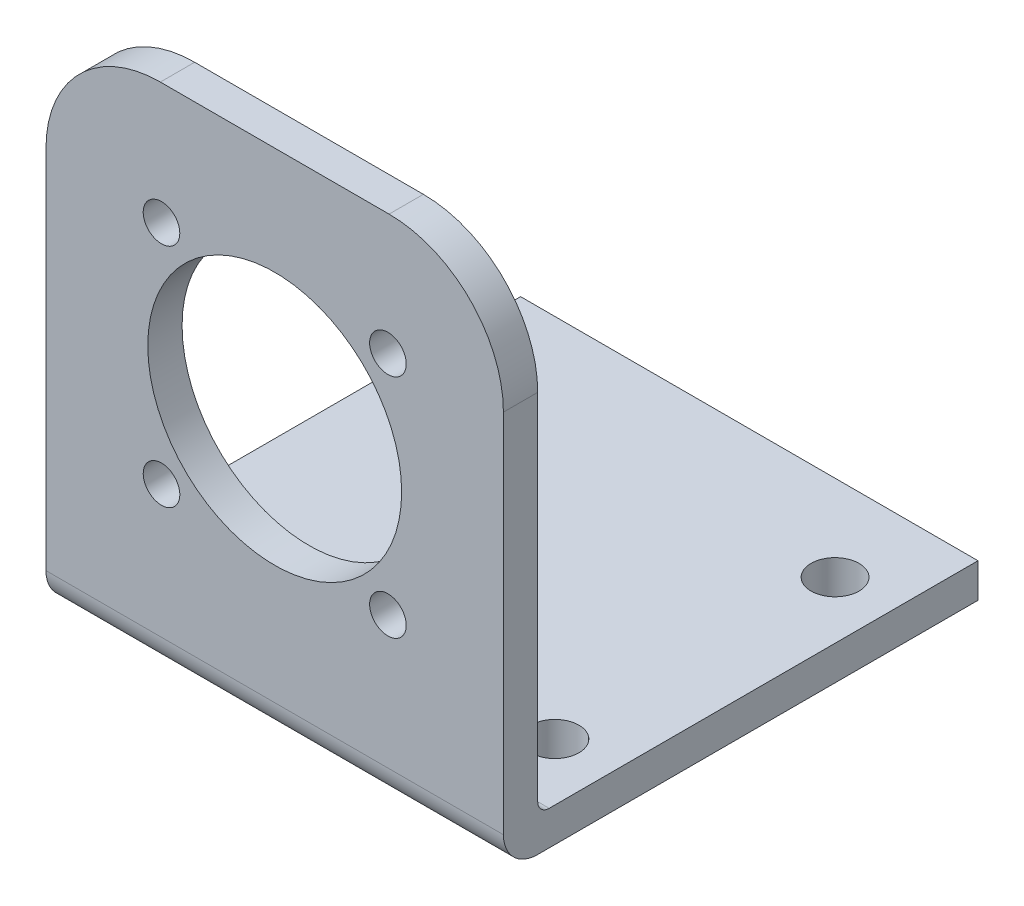
ISO-10303-21;
HEADER;
FILE_DESCRIPTION(('STEP AP214'),'2;1');
FILE_NAME('part.step','',(''),(''),'','','');
FILE_SCHEMA(('AUTOMOTIVE_DESIGN { 1 0 10303 214 1 1 1 1 }'));
ENDSEC;
DATA;
#1=APPLICATION_CONTEXT('core data for automotive mechanical design processes');
#2=APPLICATION_PROTOCOL_DEFINITION('international standard','automotive_design',2000,#1);
#3=PRODUCT_CONTEXT('',#1,'mechanical');
#4=PRODUCT('Part','Part','',(#3));
#5=PRODUCT_RELATED_PRODUCT_CATEGORY('part','',(#4));
#6=PRODUCT_DEFINITION_FORMATION('','',#4);
#7=PRODUCT_DEFINITION_CONTEXT('part definition',#1,'design');
#8=PRODUCT_DEFINITION('design','',#6,#7);
#9=PRODUCT_DEFINITION_SHAPE('','',#8);
#10=(LENGTH_UNIT() NAMED_UNIT(*) SI_UNIT(.MILLI.,.METRE.));
#11=(NAMED_UNIT(*) PLANE_ANGLE_UNIT() SI_UNIT($,.RADIAN.));
#12=(NAMED_UNIT(*) SI_UNIT($,.STERADIAN.) SOLID_ANGLE_UNIT());
#13=UNCERTAINTY_MEASURE_WITH_UNIT(LENGTH_MEASURE(1.E-05),#10,'distance_accuracy_value','');
#14=(GEOMETRIC_REPRESENTATION_CONTEXT(3) GLOBAL_UNCERTAINTY_ASSIGNED_CONTEXT((#13)) GLOBAL_UNIT_ASSIGNED_CONTEXT((#10,
#11,#12)) REPRESENTATION_CONTEXT('',''));
#15=CARTESIAN_POINT('',(0.,0.,0.));
#16=DIRECTION('',(0.,0.,1.));
#17=DIRECTION('',(1.,0.,0.));
#18=AXIS2_PLACEMENT_3D('',#15,#16,#17);
#19=CARTESIAN_POINT('',(0.,0.,3.));
#20=DIRECTION('',(0.,0.,1.));
#21=DIRECTION('',(1.,0.,0.));
#22=AXIS2_PLACEMENT_3D('',#19,#20,#21);
#23=PLANE('',#22);
#24=DIRECTION('',(0.,-1.,0.));
#25=VECTOR('',#24,1.);
#26=CARTESIAN_POINT('',(-20.,20.5,3.));
#27=LINE('',#26,#25);
#28=CARTESIAN_POINT('',(-20.,10.5,3.));
#29=VERTEX_POINT('',#28);
#30=CARTESIAN_POINT('',(-20.,-21.5,3.));
#31=VERTEX_POINT('',#30);
#32=EDGE_CURVE('E202',#29,#31,#27,.T.);
#33=ORIENTED_EDGE('',*,*,#32,.T.);
#34=DIRECTION('',(1.,0.,0.));
#35=VECTOR('',#34,1.);
#36=CARTESIAN_POINT('',(20.,-21.5,3.));
#37=LINE('',#36,#35);
#38=CARTESIAN_POINT('',(20.,-21.5,3.));
#39=VERTEX_POINT('',#38);
#40=EDGE_CURVE('E251',#31,#39,#37,.T.);
#41=ORIENTED_EDGE('',*,*,#40,.T.);
#42=DIRECTION('',(0.,1.,0.));
#43=VECTOR('',#42,1.);
#44=CARTESIAN_POINT('',(20.,20.5,3.));
#45=LINE('',#44,#43);
#46=CARTESIAN_POINT('',(20.,10.5,3.));
#47=VERTEX_POINT('',#46);
#48=EDGE_CURVE('E206',#39,#47,#45,.T.);
#49=ORIENTED_EDGE('',*,*,#48,.T.);
#50=CARTESIAN_POINT('',(10.,10.5,3.));
#51=DIRECTION('',(0.,0.,1.));
#52=DIRECTION('',(1.,0.,0.));
#53=AXIS2_PLACEMENT_3D('',#50,#51,#52);
#54=CIRCLE('',#53,10.);
#55=CARTESIAN_POINT('',(9.99999999999999,20.5,3.));
#56=VERTEX_POINT('',#55);
#57=EDGE_CURVE('E241',#47,#56,#54,.T.);
#58=ORIENTED_EDGE('',*,*,#57,.T.);
#59=DIRECTION('',(-1.,0.,0.));
#60=VECTOR('',#59,1.);
#61=CARTESIAN_POINT('',(-20.,20.5,3.));
#62=LINE('',#61,#60);
#63=CARTESIAN_POINT('',(-10.,20.5,3.));
#64=VERTEX_POINT('',#63);
#65=EDGE_CURVE('E210',#56,#64,#62,.T.);
#66=ORIENTED_EDGE('',*,*,#65,.T.);
#67=CARTESIAN_POINT('',(-9.99999999999999,10.5,3.));
#68=DIRECTION('',(0.,0.,1.));
#69=DIRECTION('',(1.,0.,0.));
#70=AXIS2_PLACEMENT_3D('',#67,#68,#69);
#71=CIRCLE('',#70,10.);
#72=EDGE_CURVE('E244',#64,#29,#71,.T.);
#73=ORIENTED_EDGE('',*,*,#72,.T.);
#74=EDGE_LOOP('',(#33,#41,#49,#58,#66,#73));
#75=FACE_BOUND('',#74,.T.);
#76=CARTESIAN_POINT('',(-9.89949493661161,-9.89949493661172,3.));
#77=DIRECTION('',(0.,0.,1.));
#78=DIRECTION('',(-1.,0.,0.));
#79=AXIS2_PLACEMENT_3D('',#76,#77,#78);
#80=CIRCLE('',#79,1.6);
#81=CARTESIAN_POINT('',(-11.4994949366116,-9.89949493661172,3.));
#82=VERTEX_POINT('',#81);
#83=EDGE_CURVE('E170',#82,#82,#80,.T.);
#84=ORIENTED_EDGE('',*,*,#83,.F.);
#85=EDGE_LOOP('',(#84));
#86=FACE_BOUND('',#85,.T.);
#87=CARTESIAN_POINT('',(9.89949493661161,9.89949493661172,3.));
#88=DIRECTION('',(0.,0.,1.));
#89=DIRECTION('',(-1.,0.,0.));
#90=AXIS2_PLACEMENT_3D('',#87,#88,#89);
#91=CIRCLE('',#90,1.6);
#92=CARTESIAN_POINT('',(8.29949493661161,9.89949493661172,3.));
#93=VERTEX_POINT('',#92);
#94=EDGE_CURVE('E186',#93,#93,#91,.T.);
#95=ORIENTED_EDGE('',*,*,#94,.F.);
#96=EDGE_LOOP('',(#95));
#97=FACE_BOUND('',#96,.T.);
#98=CARTESIAN_POINT('',(0.,0.,3.));
#99=DIRECTION('',(0.,0.,1.));
#100=DIRECTION('',(1.,0.,0.));
#101=AXIS2_PLACEMENT_3D('',#98,#99,#100);
#102=CIRCLE('',#101,11.1);
#103=CARTESIAN_POINT('',(11.1,0.,3.));
#104=VERTEX_POINT('',#103);
#105=EDGE_CURVE('E194',#104,#104,#102,.T.);
#106=ORIENTED_EDGE('',*,*,#105,.F.);
#107=EDGE_LOOP('',(#106));
#108=FACE_BOUND('',#107,.T.);
#109=CARTESIAN_POINT('',(-9.89949493661161,9.89949493661171,3.));
#110=DIRECTION('',(0.,0.,1.));
#111=DIRECTION('',(1.,0.,0.));
#112=AXIS2_PLACEMENT_3D('',#109,#110,#111);
#113=CIRCLE('',#112,1.6);
#114=CARTESIAN_POINT('',(-8.29949493661161,9.89949493661171,3.));
#115=VERTEX_POINT('',#114);
#116=EDGE_CURVE('E178',#115,#115,#113,.T.);
#117=ORIENTED_EDGE('',*,*,#116,.F.);
#118=EDGE_LOOP('',(#117));
#119=FACE_BOUND('',#118,.T.);
#120=CARTESIAN_POINT('',(9.89949493661162,-9.89949493661171,3.));
#121=DIRECTION('',(0.,0.,1.));
#122=DIRECTION('',(1.,0.,0.));
#123=AXIS2_PLACEMENT_3D('',#120,#121,#122);
#124=CIRCLE('',#123,1.6);
#125=CARTESIAN_POINT('',(11.4994949366116,-9.89949493661171,3.));
#126=VERTEX_POINT('',#125);
#127=EDGE_CURVE('E162',#126,#126,#124,.T.);
#128=ORIENTED_EDGE('',*,*,#127,.F.);
#129=EDGE_LOOP('',(#128));
#130=FACE_BOUND('',#129,.T.);
#131=ADVANCED_FACE('F40',(#75,#86,#97,#108,#119,#130),#23,.T.);
#132=CARTESIAN_POINT('',(0.,0.,0.));
#133=DIRECTION('',(0.,0.,1.));
#134=DIRECTION('',(1.,0.,0.));
#135=AXIS2_PLACEMENT_3D('',#132,#133,#134);
#136=PLANE('',#135);
#137=DIRECTION('',(0.,1.,0.));
#138=VECTOR('',#137,1.);
#139=CARTESIAN_POINT('',(20.,20.5,0.));
#140=LINE('',#139,#138);
#141=CARTESIAN_POINT('',(20.,-20.5,0.));
#142=VERTEX_POINT('',#141);
#143=CARTESIAN_POINT('',(20.,10.5,0.));
#144=VERTEX_POINT('',#143);
#145=EDGE_CURVE('E216',#142,#144,#140,.T.);
#146=ORIENTED_EDGE('',*,*,#145,.F.);
#147=DIRECTION('',(-1.,0.,0.));
#148=VECTOR('',#147,1.);
#149=CARTESIAN_POINT('',(0.,-20.5,0.));
#150=LINE('',#149,#148);
#151=CARTESIAN_POINT('',(-20.,-20.5,0.));
#152=VERTEX_POINT('',#151);
#153=EDGE_CURVE('E263',#142,#152,#150,.T.);
#154=ORIENTED_EDGE('',*,*,#153,.T.);
#155=DIRECTION('',(0.,-1.,0.));
#156=VECTOR('',#155,1.);
#157=CARTESIAN_POINT('',(-20.,20.5,0.));
#158=LINE('',#157,#156);
#159=CARTESIAN_POINT('',(-20.,10.5,0.));
#160=VERTEX_POINT('',#159);
#161=EDGE_CURVE('E198',#160,#152,#158,.T.);
#162=ORIENTED_EDGE('',*,*,#161,.F.);
#163=CARTESIAN_POINT('',(-9.99999999999999,10.5,0.));
#164=DIRECTION('',(0.,0.,1.));
#165=DIRECTION('',(1.,0.,0.));
#166=AXIS2_PLACEMENT_3D('',#163,#164,#165);
#167=CIRCLE('',#166,10.);
#168=CARTESIAN_POINT('',(-10.,20.5,0.));
#169=VERTEX_POINT('',#168);
#170=EDGE_CURVE('E231',#160,#169,#167,.F.);
#171=ORIENTED_EDGE('',*,*,#170,.T.);
#172=DIRECTION('',(-1.,0.,0.));
#173=VECTOR('',#172,1.);
#174=CARTESIAN_POINT('',(-20.,20.5,0.));
#175=LINE('',#174,#173);
#176=CARTESIAN_POINT('',(9.99999999999999,20.5,0.));
#177=VERTEX_POINT('',#176);
#178=EDGE_CURVE('E207',#177,#169,#175,.T.);
#179=ORIENTED_EDGE('',*,*,#178,.F.);
#180=CARTESIAN_POINT('',(10.,10.5,0.));
#181=DIRECTION('',(0.,0.,1.));
#182=DIRECTION('',(1.,0.,0.));
#183=AXIS2_PLACEMENT_3D('',#180,#181,#182);
#184=CIRCLE('',#183,10.);
#185=EDGE_CURVE('E227',#177,#144,#184,.F.);
#186=ORIENTED_EDGE('',*,*,#185,.T.);
#187=EDGE_LOOP('',(#146,#154,#162,#171,#179,#186));
#188=FACE_BOUND('',#187,.T.);
#189=CARTESIAN_POINT('',(0.,0.,0.));
#190=DIRECTION('',(0.,0.,1.));
#191=DIRECTION('',(1.,0.,0.));
#192=AXIS2_PLACEMENT_3D('',#189,#190,#191);
#193=CIRCLE('',#192,11.1);
#194=CARTESIAN_POINT('',(11.1,0.,0.));
#195=VERTEX_POINT('',#194);
#196=EDGE_CURVE('E190',#195,#195,#193,.T.);
#197=ORIENTED_EDGE('',*,*,#196,.T.);
#198=EDGE_LOOP('',(#197));
#199=FACE_BOUND('',#198,.T.);
#200=CARTESIAN_POINT('',(9.89949493661161,9.89949493661172,0.));
#201=DIRECTION('',(0.,0.,1.));
#202=DIRECTION('',(-1.,0.,0.));
#203=AXIS2_PLACEMENT_3D('',#200,#201,#202);
#204=CIRCLE('',#203,1.6);
#205=CARTESIAN_POINT('',(8.29949493661161,9.89949493661172,0.));
#206=VERTEX_POINT('',#205);
#207=EDGE_CURVE('E182',#206,#206,#204,.T.);
#208=ORIENTED_EDGE('',*,*,#207,.T.);
#209=EDGE_LOOP('',(#208));
#210=FACE_BOUND('',#209,.T.);
#211=CARTESIAN_POINT('',(-9.89949493661161,9.89949493661171,0.));
#212=DIRECTION('',(0.,0.,1.));
#213=DIRECTION('',(1.,0.,0.));
#214=AXIS2_PLACEMENT_3D('',#211,#212,#213);
#215=CIRCLE('',#214,1.6);
#216=CARTESIAN_POINT('',(-8.29949493661161,9.89949493661171,0.));
#217=VERTEX_POINT('',#216);
#218=EDGE_CURVE('E174',#217,#217,#215,.T.);
#219=ORIENTED_EDGE('',*,*,#218,.T.);
#220=EDGE_LOOP('',(#219));
#221=FACE_BOUND('',#220,.T.);
#222=CARTESIAN_POINT('',(-9.89949493661161,-9.89949493661172,0.));
#223=DIRECTION('',(0.,0.,1.));
#224=DIRECTION('',(-1.,0.,0.));
#225=AXIS2_PLACEMENT_3D('',#222,#223,#224);
#226=CIRCLE('',#225,1.6);
#227=CARTESIAN_POINT('',(-11.4994949366116,-9.89949493661172,0.));
#228=VERTEX_POINT('',#227);
#229=EDGE_CURVE('E166',#228,#228,#226,.T.);
#230=ORIENTED_EDGE('',*,*,#229,.T.);
#231=EDGE_LOOP('',(#230));
#232=FACE_BOUND('',#231,.T.);
#233=CARTESIAN_POINT('',(9.89949493661162,-9.89949493661171,0.));
#234=DIRECTION('',(0.,0.,1.));
#235=DIRECTION('',(1.,0.,0.));
#236=AXIS2_PLACEMENT_3D('',#233,#234,#235);
#237=CIRCLE('',#236,1.6);
#238=CARTESIAN_POINT('',(11.4994949366116,-9.89949493661171,0.));
#239=VERTEX_POINT('',#238);
#240=EDGE_CURVE('E159',#239,#239,#237,.T.);
#241=ORIENTED_EDGE('',*,*,#240,.T.);
#242=EDGE_LOOP('',(#241));
#243=FACE_BOUND('',#242,.T.);
#244=ADVANCED_FACE('F273',(#188,#199,#210,#221,#232,#243),#136,.F.);
#245=CARTESIAN_POINT('',(-20.,20.5,3.));
#246=DIRECTION('',(1.,0.,0.));
#247=DIRECTION('',(0.,1.,0.));
#248=AXIS2_PLACEMENT_3D('',#245,#246,#247);
#249=PLANE('',#248);
#250=DIRECTION('',(0.,0.,-1.));
#251=VECTOR('',#250,1.);
#252=CARTESIAN_POINT('',(-20.,-24.5,3.));
#253=LINE('',#252,#251);
#254=CARTESIAN_POINT('',(-20.,-24.5,0.));
#255=VERTEX_POINT('',#254);
#256=CARTESIAN_POINT('',(-20.,-24.5,-38.5));
#257=VERTEX_POINT('',#256);
#258=EDGE_CURVE('E116',#255,#257,#253,.T.);
#259=ORIENTED_EDGE('',*,*,#258,.F.);
#260=CARTESIAN_POINT('',(-20.,-21.5,0.));
#261=DIRECTION('',(1.,0.,0.));
#262=DIRECTION('',(0.,1.,0.));
#263=AXIS2_PLACEMENT_3D('',#260,#261,#262);
#264=CIRCLE('',#263,3.);
#265=EDGE_CURVE('E260',#255,#31,#264,.F.);
#266=ORIENTED_EDGE('',*,*,#265,.T.);
#267=ORIENTED_EDGE('',*,*,#32,.F.);
#268=DIRECTION('',(0.,0.,-1.));
#269=VECTOR('',#268,1.);
#270=CARTESIAN_POINT('',(-20.,10.5,3.));
#271=LINE('',#270,#269);
#272=EDGE_CURVE('E126',#29,#160,#271,.T.);
#273=ORIENTED_EDGE('',*,*,#272,.T.);
#274=ORIENTED_EDGE('',*,*,#161,.T.);
#275=CARTESIAN_POINT('',(-20.,-20.5,-1.));
#276=DIRECTION('',(1.,0.,0.));
#277=DIRECTION('',(0.,1.,0.));
#278=AXIS2_PLACEMENT_3D('',#275,#276,#277);
#279=CIRCLE('',#278,1.);
#280=CARTESIAN_POINT('',(-20.,-21.5,-1.));
#281=VERTEX_POINT('',#280);
#282=EDGE_CURVE('E49',#152,#281,#279,.T.);
#283=ORIENTED_EDGE('',*,*,#282,.T.);
#284=DIRECTION('',(0.,0.,1.));
#285=VECTOR('',#284,1.);
#286=CARTESIAN_POINT('',(-20.,-21.5,-38.5));
#287=LINE('',#286,#285);
#288=CARTESIAN_POINT('',(-20.,-21.5,-38.5));
#289=VERTEX_POINT('',#288);
#290=EDGE_CURVE('E141',#289,#281,#287,.T.);
#291=ORIENTED_EDGE('',*,*,#290,.F.);
#292=DIRECTION('',(0.,-1.,0.));
#293=VECTOR('',#292,1.);
#294=CARTESIAN_POINT('',(-20.,-21.5,-38.5));
#295=LINE('',#294,#293);
#296=EDGE_CURVE('E134',#289,#257,#295,.T.);
#297=ORIENTED_EDGE('',*,*,#296,.T.);
#298=EDGE_LOOP('',(#259,#266,#267,#273,#274,#283,#291,#297));
#299=FACE_BOUND('',#298,.T.);
#300=ADVANCED_FACE('F140',(#299),#249,.F.);
#301=CARTESIAN_POINT('',(-20.,-24.5,3.));
#302=DIRECTION('',(0.,1.,0.));
#303=DIRECTION('',(-1.,0.,0.));
#304=AXIS2_PLACEMENT_3D('',#301,#302,#303);
#305=PLANE('',#304);
#306=CARTESIAN_POINT('',(15.,-24.5,-31.));
#307=DIRECTION('',(0.,1.,0.));
#308=DIRECTION('',(1.,0.,0.));
#309=AXIS2_PLACEMENT_3D('',#306,#307,#308);
#310=CIRCLE('',#309,2.1);
#311=CARTESIAN_POINT('',(17.1,-24.5,-31.));
#312=VERTEX_POINT('',#311);
#313=EDGE_CURVE('E517',#312,#312,#310,.T.);
#314=ORIENTED_EDGE('',*,*,#313,.T.);
#315=EDGE_LOOP('',(#314));
#316=FACE_BOUND('',#315,.T.);
#317=CARTESIAN_POINT('',(-15.,-24.5,-6.5));
#318=DIRECTION('',(0.,1.,0.));
#319=DIRECTION('',(-1.,0.,0.));
#320=AXIS2_PLACEMENT_3D('',#317,#318,#319);
#321=CIRCLE('',#320,2.1);
#322=CARTESIAN_POINT('',(-17.1,-24.5,-6.5));
#323=VERTEX_POINT('',#322);
#324=EDGE_CURVE('E522',#323,#323,#321,.T.);
#325=ORIENTED_EDGE('',*,*,#324,.T.);
#326=EDGE_LOOP('',(#325));
#327=FACE_BOUND('',#326,.T.);
#328=CARTESIAN_POINT('',(15.,-24.5,-6.5));
#329=DIRECTION('',(0.,1.,0.));
#330=DIRECTION('',(1.,0.,0.));
#331=AXIS2_PLACEMENT_3D('',#328,#329,#330);
#332=CIRCLE('',#331,2.1);
#333=CARTESIAN_POINT('',(17.1,-24.5,-6.5));
#334=VERTEX_POINT('',#333);
#335=EDGE_CURVE('E534',#334,#334,#332,.T.);
#336=ORIENTED_EDGE('',*,*,#335,.T.);
#337=EDGE_LOOP('',(#336));
#338=FACE_BOUND('',#337,.T.);
#339=CARTESIAN_POINT('',(-15.,-24.5,-31.));
#340=DIRECTION('',(0.,1.,0.));
#341=DIRECTION('',(-1.,0.,0.));
#342=AXIS2_PLACEMENT_3D('',#339,#340,#341);
#343=CIRCLE('',#342,2.1);
#344=CARTESIAN_POINT('',(-17.1,-24.5,-31.));
#345=VERTEX_POINT('',#344);
#346=EDGE_CURVE('E143',#345,#345,#343,.T.);
#347=ORIENTED_EDGE('',*,*,#346,.T.);
#348=EDGE_LOOP('',(#347));
#349=FACE_BOUND('',#348,.T.);
#350=DIRECTION('',(0.,0.,-1.));
#351=VECTOR('',#350,1.);
#352=CARTESIAN_POINT('',(20.,-24.5,3.));
#353=LINE('',#352,#351);
#354=CARTESIAN_POINT('',(20.,-24.5,0.));
#355=VERTEX_POINT('',#354);
#356=CARTESIAN_POINT('',(20.,-24.5,-38.5));
#357=VERTEX_POINT('',#356);
#358=EDGE_CURVE('E127',#355,#357,#353,.T.);
#359=ORIENTED_EDGE('',*,*,#358,.F.);
#360=DIRECTION('',(1.,0.,0.));
#361=VECTOR('',#360,1.);
#362=CARTESIAN_POINT('',(-20.,-24.5,0.));
#363=LINE('',#362,#361);
#364=EDGE_CURVE('E122',#355,#255,#363,.F.);
#365=ORIENTED_EDGE('',*,*,#364,.T.);
#366=ORIENTED_EDGE('',*,*,#258,.T.);
#367=DIRECTION('',(1.,0.,0.));
#368=VECTOR('',#367,1.);
#369=CARTESIAN_POINT('',(-20.,-24.5,-38.5));
#370=LINE('',#369,#368);
#371=EDGE_CURVE('E120',#257,#357,#370,.T.);
#372=ORIENTED_EDGE('',*,*,#371,.T.);
#373=EDGE_LOOP('',(#359,#365,#366,#372));
#374=FACE_BOUND('',#373,.T.);
#375=ADVANCED_FACE('F119',(#316,#327,#338,#349,#374),#305,.F.);
#376=CARTESIAN_POINT('',(20.,20.5,3.));
#377=DIRECTION('',(-1.,0.,0.));
#378=DIRECTION('',(0.,-1.,0.));
#379=AXIS2_PLACEMENT_3D('',#376,#377,#378);
#380=PLANE('',#379);
#381=ORIENTED_EDGE('',*,*,#48,.F.);
#382=CARTESIAN_POINT('',(20.,-21.5,0.));
#383=DIRECTION('',(-1.,0.,0.));
#384=DIRECTION('',(0.,-1.,0.));
#385=AXIS2_PLACEMENT_3D('',#382,#383,#384);
#386=CIRCLE('',#385,3.);
#387=EDGE_CURVE('E255',#39,#355,#386,.F.);
#388=ORIENTED_EDGE('',*,*,#387,.T.);
#389=ORIENTED_EDGE('',*,*,#358,.T.);
#390=DIRECTION('',(0.,1.,0.));
#391=VECTOR('',#390,1.);
#392=CARTESIAN_POINT('',(20.,-21.5,-38.5));
#393=LINE('',#392,#391);
#394=CARTESIAN_POINT('',(20.,-21.5,-38.5));
#395=VERTEX_POINT('',#394);
#396=EDGE_CURVE('E137',#357,#395,#393,.T.);
#397=ORIENTED_EDGE('',*,*,#396,.T.);
#398=DIRECTION('',(0.,0.,1.));
#399=VECTOR('',#398,1.);
#400=CARTESIAN_POINT('',(20.,-21.5,-38.5));
#401=LINE('',#400,#399);
#402=CARTESIAN_POINT('',(20.,-21.5,-1.));
#403=VERTEX_POINT('',#402);
#404=EDGE_CURVE('E156',#395,#403,#401,.T.);
#405=ORIENTED_EDGE('',*,*,#404,.T.);
#406=CARTESIAN_POINT('',(20.,-20.5,-1.));
#407=DIRECTION('',(-1.,0.,0.));
#408=DIRECTION('',(0.,-1.,0.));
#409=AXIS2_PLACEMENT_3D('',#406,#407,#408);
#410=CIRCLE('',#409,1.);
#411=EDGE_CURVE('E11',#403,#142,#410,.T.);
#412=ORIENTED_EDGE('',*,*,#411,.T.);
#413=ORIENTED_EDGE('',*,*,#145,.T.);
#414=DIRECTION('',(0.,0.,-1.));
#415=VECTOR('',#414,1.);
#416=CARTESIAN_POINT('',(20.,10.5,3.));
#417=LINE('',#416,#415);
#418=EDGE_CURVE('E247',#144,#47,#417,.F.);
#419=ORIENTED_EDGE('',*,*,#418,.T.);
#420=EDGE_LOOP('',(#381,#388,#389,#397,#405,#412,#413,#419));
#421=FACE_BOUND('',#420,.T.);
#422=ADVANCED_FACE('F294',(#421),#380,.F.);
#423=CARTESIAN_POINT('',(-20.,20.5,3.));
#424=DIRECTION('',(0.,-1.,0.));
#425=DIRECTION('',(1.,0.,0.));
#426=AXIS2_PLACEMENT_3D('',#423,#424,#425);
#427=PLANE('',#426);
#428=ORIENTED_EDGE('',*,*,#178,.T.);
#429=DIRECTION('',(0.,0.,-1.));
#430=VECTOR('',#429,1.);
#431=CARTESIAN_POINT('',(-10.,20.5,3.));
#432=LINE('',#431,#430);
#433=EDGE_CURVE('E238',#169,#64,#432,.F.);
#434=ORIENTED_EDGE('',*,*,#433,.T.);
#435=ORIENTED_EDGE('',*,*,#65,.F.);
#436=DIRECTION('',(0.,0.,-1.));
#437=VECTOR('',#436,1.);
#438=CARTESIAN_POINT('',(9.99999999999999,20.5,3.));
#439=LINE('',#438,#437);
#440=EDGE_CURVE('E234',#56,#177,#439,.T.);
#441=ORIENTED_EDGE('',*,*,#440,.T.);
#442=EDGE_LOOP('',(#428,#434,#435,#441));
#443=FACE_BOUND('',#442,.T.);
#444=ADVANCED_FACE('F285',(#443),#427,.F.);
#445=CARTESIAN_POINT('',(0.,0.,3.));
#446=DIRECTION('',(0.,0.,-1.));
#447=DIRECTION('',(-1.,0.,0.));
#448=AXIS2_PLACEMENT_3D('',#445,#446,#447);
#449=CYLINDRICAL_SURFACE('',#448,11.1);
#450=ORIENTED_EDGE('',*,*,#105,.T.);
#451=EDGE_LOOP('',(#450));
#452=FACE_BOUND('',#451,.T.);
#453=ORIENTED_EDGE('',*,*,#196,.F.);
#454=EDGE_LOOP('',(#453));
#455=FACE_BOUND('',#454,.T.);
#456=ADVANCED_FACE('F310',(#452,#455),#449,.F.);
#457=CARTESIAN_POINT('',(9.89949493661161,9.89949493661172,3.));
#458=DIRECTION('',(0.,0.,-1.));
#459=DIRECTION('',(-1.,0.,0.));
#460=AXIS2_PLACEMENT_3D('',#457,#458,#459);
#461=CYLINDRICAL_SURFACE('',#460,1.6);
#462=ORIENTED_EDGE('',*,*,#94,.T.);
#463=EDGE_LOOP('',(#462));
#464=FACE_BOUND('',#463,.T.);
#465=ORIENTED_EDGE('',*,*,#207,.F.);
#466=EDGE_LOOP('',(#465));
#467=FACE_BOUND('',#466,.T.);
#468=ADVANCED_FACE('F438',(#464,#467),#461,.F.);
#469=CARTESIAN_POINT('',(-9.89949493661161,9.89949493661171,3.));
#470=DIRECTION('',(0.,0.,-1.));
#471=DIRECTION('',(-1.,0.,0.));
#472=AXIS2_PLACEMENT_3D('',#469,#470,#471);
#473=CYLINDRICAL_SURFACE('',#472,1.6);
#474=ORIENTED_EDGE('',*,*,#116,.T.);
#475=EDGE_LOOP('',(#474));
#476=FACE_BOUND('',#475,.T.);
#477=ORIENTED_EDGE('',*,*,#218,.F.);
#478=EDGE_LOOP('',(#477));
#479=FACE_BOUND('',#478,.T.);
#480=ADVANCED_FACE('F444',(#476,#479),#473,.F.);
#481=CARTESIAN_POINT('',(-9.89949493661161,-9.89949493661172,3.));
#482=DIRECTION('',(0.,0.,-1.));
#483=DIRECTION('',(-1.,0.,0.));
#484=AXIS2_PLACEMENT_3D('',#481,#482,#483);
#485=CYLINDRICAL_SURFACE('',#484,1.6);
#486=ORIENTED_EDGE('',*,*,#83,.T.);
#487=EDGE_LOOP('',(#486));
#488=FACE_BOUND('',#487,.T.);
#489=ORIENTED_EDGE('',*,*,#229,.F.);
#490=EDGE_LOOP('',(#489));
#491=FACE_BOUND('',#490,.T.);
#492=ADVANCED_FACE('F450',(#488,#491),#485,.F.);
#493=CARTESIAN_POINT('',(9.89949493661162,-9.89949493661171,3.));
#494=DIRECTION('',(0.,0.,-1.));
#495=DIRECTION('',(-1.,0.,0.));
#496=AXIS2_PLACEMENT_3D('',#493,#494,#495);
#497=CYLINDRICAL_SURFACE('',#496,1.6);
#498=ORIENTED_EDGE('',*,*,#127,.T.);
#499=EDGE_LOOP('',(#498));
#500=FACE_BOUND('',#499,.T.);
#501=ORIENTED_EDGE('',*,*,#240,.F.);
#502=EDGE_LOOP('',(#501));
#503=FACE_BOUND('',#502,.T.);
#504=ADVANCED_FACE('F370',(#500,#503),#497,.F.);
#505=CARTESIAN_POINT('',(-20.,-21.5,-38.5));
#506=DIRECTION('',(0.,1.,0.));
#507=DIRECTION('',(-1.,0.,0.));
#508=AXIS2_PLACEMENT_3D('',#505,#506,#507);
#509=PLANE('',#508);
#510=CARTESIAN_POINT('',(15.,-21.5,-31.));
#511=DIRECTION('',(0.,1.,0.));
#512=DIRECTION('',(1.,0.,0.));
#513=AXIS2_PLACEMENT_3D('',#510,#511,#512);
#514=CIRCLE('',#513,2.1);
#515=CARTESIAN_POINT('',(17.1,-21.5,-31.));
#516=VERTEX_POINT('',#515);
#517=EDGE_CURVE('E520',#516,#516,#514,.T.);
#518=ORIENTED_EDGE('',*,*,#517,.F.);
#519=EDGE_LOOP('',(#518));
#520=FACE_BOUND('',#519,.T.);
#521=CARTESIAN_POINT('',(-15.,-21.5,-6.5));
#522=DIRECTION('',(0.,1.,0.));
#523=DIRECTION('',(-1.,0.,0.));
#524=AXIS2_PLACEMENT_3D('',#521,#522,#523);
#525=CIRCLE('',#524,2.1);
#526=CARTESIAN_POINT('',(-17.1,-21.5,-6.5));
#527=VERTEX_POINT('',#526);
#528=EDGE_CURVE('E528',#527,#527,#525,.T.);
#529=ORIENTED_EDGE('',*,*,#528,.F.);
#530=EDGE_LOOP('',(#529));
#531=FACE_BOUND('',#530,.T.);
#532=CARTESIAN_POINT('',(15.,-21.5,-6.5));
#533=DIRECTION('',(0.,1.,0.));
#534=DIRECTION('',(1.,0.,0.));
#535=AXIS2_PLACEMENT_3D('',#532,#533,#534);
#536=CIRCLE('',#535,2.1);
#537=CARTESIAN_POINT('',(17.1,-21.5,-6.5));
#538=VERTEX_POINT('',#537);
#539=EDGE_CURVE('E539',#538,#538,#536,.T.);
#540=ORIENTED_EDGE('',*,*,#539,.F.);
#541=EDGE_LOOP('',(#540));
#542=FACE_BOUND('',#541,.T.);
#543=CARTESIAN_POINT('',(-15.,-21.5,-31.));
#544=DIRECTION('',(0.,1.,0.));
#545=DIRECTION('',(-1.,0.,0.));
#546=AXIS2_PLACEMENT_3D('',#543,#544,#545);
#547=CIRCLE('',#546,2.1);
#548=CARTESIAN_POINT('',(-17.1,-21.5,-31.));
#549=VERTEX_POINT('',#548);
#550=EDGE_CURVE('E147',#549,#549,#547,.T.);
#551=ORIENTED_EDGE('',*,*,#550,.F.);
#552=EDGE_LOOP('',(#551));
#553=FACE_BOUND('',#552,.T.);
#554=ORIENTED_EDGE('',*,*,#290,.T.);
#555=DIRECTION('',(-1.,0.,0.));
#556=VECTOR('',#555,1.);
#557=CARTESIAN_POINT('',(-20.,-21.5,-1.));
#558=LINE('',#557,#556);
#559=EDGE_CURVE('E62',#281,#403,#558,.F.);
#560=ORIENTED_EDGE('',*,*,#559,.T.);
#561=ORIENTED_EDGE('',*,*,#404,.F.);
#562=DIRECTION('',(-1.,0.,0.));
#563=VECTOR('',#562,1.);
#564=CARTESIAN_POINT('',(-20.,-21.5,-38.5));
#565=LINE('',#564,#563);
#566=EDGE_CURVE('E153',#395,#289,#565,.T.);
#567=ORIENTED_EDGE('',*,*,#566,.T.);
#568=EDGE_LOOP('',(#554,#560,#561,#567));
#569=FACE_BOUND('',#568,.T.);
#570=ADVANCED_FACE('F367',(#520,#531,#542,#553,#569),#509,.T.);
#571=CARTESIAN_POINT('',(0.,0.,-38.5));
#572=DIRECTION('',(0.,0.,1.));
#573=DIRECTION('',(1.,0.,0.));
#574=AXIS2_PLACEMENT_3D('',#571,#572,#573);
#575=PLANE('',#574);
#576=ORIENTED_EDGE('',*,*,#296,.F.);
#577=ORIENTED_EDGE('',*,*,#566,.F.);
#578=ORIENTED_EDGE('',*,*,#396,.F.);
#579=ORIENTED_EDGE('',*,*,#371,.F.);
#580=EDGE_LOOP('',(#576,#577,#578,#579));
#581=FACE_BOUND('',#580,.T.);
#582=ADVANCED_FACE('F132',(#581),#575,.F.);
#583=CARTESIAN_POINT('',(-15.,-24.5,-31.));
#584=DIRECTION('',(0.,1.,0.));
#585=DIRECTION('',(-1.,0.,0.));
#586=AXIS2_PLACEMENT_3D('',#583,#584,#585);
#587=CYLINDRICAL_SURFACE('',#586,2.1);
#588=ORIENTED_EDGE('',*,*,#346,.F.);
#589=EDGE_LOOP('',(#588));
#590=FACE_BOUND('',#589,.T.);
#591=ORIENTED_EDGE('',*,*,#550,.T.);
#592=EDGE_LOOP('',(#591));
#593=FACE_BOUND('',#592,.T.);
#594=ADVANCED_FACE('F388',(#590,#593),#587,.F.);
#595=CARTESIAN_POINT('',(15.,-24.5,-6.5));
#596=DIRECTION('',(0.,1.,0.));
#597=DIRECTION('',(-1.,0.,0.));
#598=AXIS2_PLACEMENT_3D('',#595,#596,#597);
#599=CYLINDRICAL_SURFACE('',#598,2.1);
#600=ORIENTED_EDGE('',*,*,#335,.F.);
#601=EDGE_LOOP('',(#600));
#602=FACE_BOUND('',#601,.T.);
#603=ORIENTED_EDGE('',*,*,#539,.T.);
#604=EDGE_LOOP('',(#603));
#605=FACE_BOUND('',#604,.T.);
#606=ADVANCED_FACE('F394',(#602,#605),#599,.F.);
#607=CARTESIAN_POINT('',(-15.,-24.5,-6.5));
#608=DIRECTION('',(0.,1.,0.));
#609=DIRECTION('',(-1.,0.,0.));
#610=AXIS2_PLACEMENT_3D('',#607,#608,#609);
#611=CYLINDRICAL_SURFACE('',#610,2.1);
#612=ORIENTED_EDGE('',*,*,#324,.F.);
#613=EDGE_LOOP('',(#612));
#614=FACE_BOUND('',#613,.T.);
#615=ORIENTED_EDGE('',*,*,#528,.T.);
#616=EDGE_LOOP('',(#615));
#617=FACE_BOUND('',#616,.T.);
#618=ADVANCED_FACE('F402',(#614,#617),#611,.F.);
#619=CARTESIAN_POINT('',(15.,-24.5,-31.));
#620=DIRECTION('',(0.,1.,0.));
#621=DIRECTION('',(-1.,0.,0.));
#622=AXIS2_PLACEMENT_3D('',#619,#620,#621);
#623=CYLINDRICAL_SURFACE('',#622,2.1);
#624=ORIENTED_EDGE('',*,*,#313,.F.);
#625=EDGE_LOOP('',(#624));
#626=FACE_BOUND('',#625,.T.);
#627=ORIENTED_EDGE('',*,*,#517,.T.);
#628=EDGE_LOOP('',(#627));
#629=FACE_BOUND('',#628,.T.);
#630=ADVANCED_FACE('F324',(#626,#629),#623,.F.);
#631=CARTESIAN_POINT('',(-9.99999999999999,10.5,3.));
#632=DIRECTION('',(0.,0.,-1.));
#633=DIRECTION('',(-1.,0.,0.));
#634=AXIS2_PLACEMENT_3D('',#631,#632,#633);
#635=CYLINDRICAL_SURFACE('',#634,10.);
#636=ORIENTED_EDGE('',*,*,#72,.F.);
#637=ORIENTED_EDGE('',*,*,#433,.F.);
#638=ORIENTED_EDGE('',*,*,#170,.F.);
#639=ORIENTED_EDGE('',*,*,#272,.F.);
#640=EDGE_LOOP('',(#636,#637,#638,#639));
#641=FACE_BOUND('',#640,.T.);
#642=ADVANCED_FACE('F281',(#641),#635,.T.);
#643=CARTESIAN_POINT('',(10.,10.5,3.));
#644=DIRECTION('',(0.,0.,-1.));
#645=DIRECTION('',(-1.,0.,0.));
#646=AXIS2_PLACEMENT_3D('',#643,#644,#645);
#647=CYLINDRICAL_SURFACE('',#646,10.);
#648=ORIENTED_EDGE('',*,*,#57,.F.);
#649=ORIENTED_EDGE('',*,*,#418,.F.);
#650=ORIENTED_EDGE('',*,*,#185,.F.);
#651=ORIENTED_EDGE('',*,*,#440,.F.);
#652=EDGE_LOOP('',(#648,#649,#650,#651));
#653=FACE_BOUND('',#652,.T.);
#654=ADVANCED_FACE('F290',(#653),#647,.T.);
#655=CARTESIAN_POINT('',(0.,-21.5,0.));
#656=DIRECTION('',(-1.,0.,0.));
#657=DIRECTION('',(0.,-1.,0.));
#658=AXIS2_PLACEMENT_3D('',#655,#656,#657);
#659=CYLINDRICAL_SURFACE('',#658,3.);
#660=ORIENTED_EDGE('',*,*,#265,.F.);
#661=ORIENTED_EDGE('',*,*,#364,.F.);
#662=ORIENTED_EDGE('',*,*,#387,.F.);
#663=ORIENTED_EDGE('',*,*,#40,.F.);
#664=EDGE_LOOP('',(#660,#661,#662,#663));
#665=FACE_BOUND('',#664,.T.);
#666=ADVANCED_FACE('F296',(#665),#659,.T.);
#667=CARTESIAN_POINT('',(0.,-20.5,-1.));
#668=DIRECTION('',(-1.,0.,0.));
#669=DIRECTION('',(0.,-1.,0.));
#670=AXIS2_PLACEMENT_3D('',#667,#668,#669);
#671=CYLINDRICAL_SURFACE('',#670,1.);
#672=ORIENTED_EDGE('',*,*,#411,.F.);
#673=ORIENTED_EDGE('',*,*,#559,.F.);
#674=ORIENTED_EDGE('',*,*,#282,.F.);
#675=ORIENTED_EDGE('',*,*,#153,.F.);
#676=EDGE_LOOP('',(#672,#673,#674,#675));
#677=FACE_BOUND('',#676,.T.);
#678=ADVANCED_FACE('F42',(#677),#671,.F.);
#679=CLOSED_SHELL('',(#131,#244,#300,#375,#422,#444,#456,#468,#480,#492,#504,#570,#582,#594,
#606,#618,#630,#642,#654,#666,#678));
#680=MANIFOLD_SOLID_BREP('B2',#679);
#681=ADVANCED_BREP_SHAPE_REPRESENTATION('',(#18,#680),#14);
#682=SHAPE_DEFINITION_REPRESENTATION(#9,#681);
ENDSEC;
END-ISO-10303-21;
